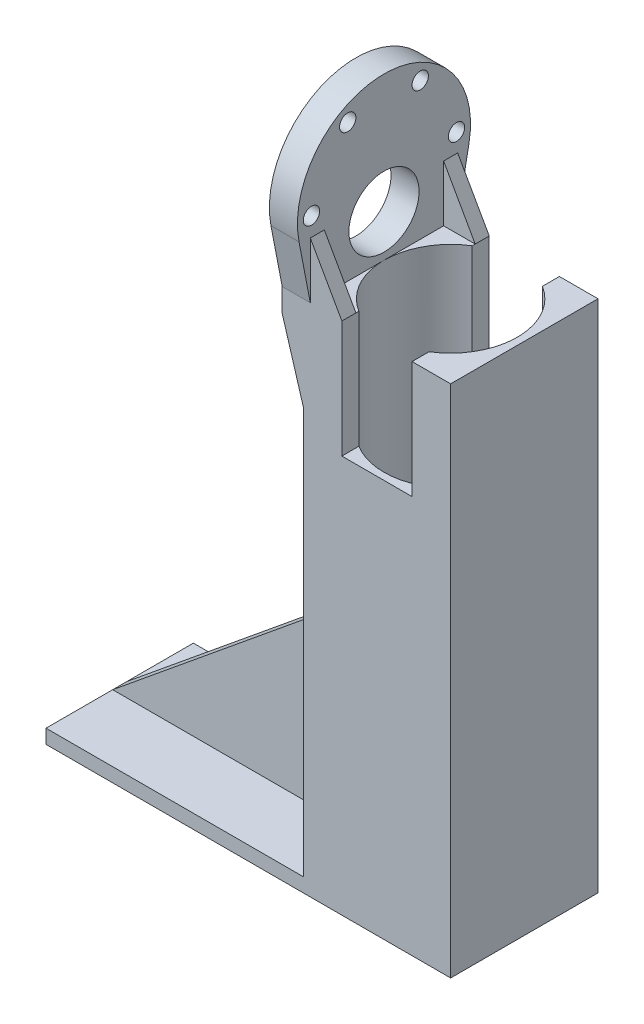
ISO-10303-21;
HEADER;
FILE_DESCRIPTION(('STEP AP214'),'2;1');
FILE_NAME('part.step','',(''),(''),'','','');
FILE_SCHEMA(('AUTOMOTIVE_DESIGN { 1 0 10303 214 1 1 1 1 }'));
ENDSEC;
DATA;
#1=APPLICATION_CONTEXT('core data for automotive mechanical design processes');
#2=APPLICATION_PROTOCOL_DEFINITION('international standard','automotive_design',2000,#1);
#3=PRODUCT_CONTEXT('',#1,'mechanical');
#4=PRODUCT('Part','Part','',(#3));
#5=PRODUCT_RELATED_PRODUCT_CATEGORY('part','',(#4));
#6=PRODUCT_DEFINITION_FORMATION('','',#4);
#7=PRODUCT_DEFINITION_CONTEXT('part definition',#1,'design');
#8=PRODUCT_DEFINITION('design','',#6,#7);
#9=PRODUCT_DEFINITION_SHAPE('','',#8);
#10=(LENGTH_UNIT() NAMED_UNIT(*) SI_UNIT(.MILLI.,.METRE.));
#11=(NAMED_UNIT(*) PLANE_ANGLE_UNIT() SI_UNIT($,.RADIAN.));
#12=(NAMED_UNIT(*) SI_UNIT($,.STERADIAN.) SOLID_ANGLE_UNIT());
#13=UNCERTAINTY_MEASURE_WITH_UNIT(LENGTH_MEASURE(1.E-05),#10,'distance_accuracy_value','');
#14=(GEOMETRIC_REPRESENTATION_CONTEXT(3) GLOBAL_UNCERTAINTY_ASSIGNED_CONTEXT((#13)) GLOBAL_UNIT_ASSIGNED_CONTEXT((#10,
#11,#12)) REPRESENTATION_CONTEXT('',''));
#15=CARTESIAN_POINT('',(0.,0.,0.));
#16=DIRECTION('',(0.,0.,1.));
#17=DIRECTION('',(1.,0.,0.));
#18=AXIS2_PLACEMENT_3D('',#15,#16,#17);
#19=CARTESIAN_POINT('',(0.,110.,0.));
#20=DIRECTION('',(0.,1.,0.));
#21=DIRECTION('',(0.,0.,1.));
#22=AXIS2_PLACEMENT_3D('',#19,#20,#21);
#23=PLANE('',#22);
#24=DIRECTION('',(0.,0.,1.));
#25=VECTOR('',#24,1.);
#26=CARTESIAN_POINT('',(8.25,110.,31.5));
#27=LINE('',#26,#25);
#28=CARTESIAN_POINT('',(8.25,110.,3.));
#29=VERTEX_POINT('',#28);
#30=CARTESIAN_POINT('',(8.25,110.,3.63337918394737));
#31=VERTEX_POINT('',#30);
#32=EDGE_CURVE('E362',#29,#31,#27,.T.);
#33=ORIENTED_EDGE('',*,*,#32,.F.);
#34=DIRECTION('',(-1.,0.,0.));
#35=VECTOR('',#34,1.);
#36=CARTESIAN_POINT('',(8.25,110.,3.));
#37=LINE('',#36,#35);
#38=CARTESIAN_POINT('',(1.5,110.,3.));
#39=VERTEX_POINT('',#38);
#40=EDGE_CURVE('E264',#29,#39,#37,.T.);
#41=ORIENTED_EDGE('',*,*,#40,.T.);
#42=DIRECTION('',(0.,0.,1.));
#43=VECTOR('',#42,1.);
#44=CARTESIAN_POINT('',(1.5,110.,0.));
#45=LINE('',#44,#43);
#46=CARTESIAN_POINT('',(1.5,110.,15.75));
#47=VERTEX_POINT('',#46);
#48=EDGE_CURVE('E441',#39,#47,#45,.T.);
#49=ORIENTED_EDGE('',*,*,#48,.T.);
#50=CARTESIAN_POINT('',(15.75,110.,15.75));
#51=DIRECTION('',(0.,1.,0.));
#52=DIRECTION('',(0.,0.,1.));
#53=AXIS2_PLACEMENT_3D('',#50,#51,#52);
#54=CIRCLE('',#53,14.25);
#55=EDGE_CURVE('E452',#31,#47,#54,.T.);
#56=ORIENTED_EDGE('',*,*,#55,.F.);
#57=EDGE_LOOP('',(#33,#41,#49,#56));
#58=FACE_BOUND('',#57,.T.);
#59=ADVANCED_FACE('F43',(#58),#23,.T.);
#60=CARTESIAN_POINT('',(1.5,126.,15.75));
#61=DIRECTION('',(-1.,0.,0.));
#62=DIRECTION('',(0.,0.,1.));
#63=AXIS2_PLACEMENT_3D('',#60,#61,#62);
#64=PLANE('',#63);
#65=CARTESIAN_POINT('',(1.5,126.,31.25));
#66=DIRECTION('',(-1.,0.,0.));
#67=DIRECTION('',(0.,0.,1.));
#68=AXIS2_PLACEMENT_3D('',#65,#66,#67);
#69=CIRCLE('',#68,1.75);
#70=CARTESIAN_POINT('',(1.50000000000001,126.,33.));
#71=VERTEX_POINT('',#70);
#72=EDGE_CURVE('E252',#71,#71,#69,.T.);
#73=ORIENTED_EDGE('',*,*,#72,.T.);
#74=EDGE_LOOP('',(#73));
#75=FACE_BOUND('',#74,.T.);
#76=CARTESIAN_POINT('',(1.5,126.,0.249999999999993));
#77=DIRECTION('',(-1.,0.,0.));
#78=DIRECTION('',(0.,0.,1.));
#79=AXIS2_PLACEMENT_3D('',#76,#77,#78);
#80=CIRCLE('',#79,1.75);
#81=CARTESIAN_POINT('',(1.5,126.,1.99999999999999));
#82=VERTEX_POINT('',#81);
#83=EDGE_CURVE('E522',#82,#82,#80,.T.);
#84=ORIENTED_EDGE('',*,*,#83,.T.);
#85=EDGE_LOOP('',(#84));
#86=FACE_BOUND('',#85,.T.);
#87=CARTESIAN_POINT('',(1.5,139.423393758659,7.99999999999995));
#88=DIRECTION('',(-1.,0.,0.));
#89=DIRECTION('',(0.,0.,1.));
#90=AXIS2_PLACEMENT_3D('',#87,#88,#89);
#91=CIRCLE('',#90,1.74999999999999);
#92=CARTESIAN_POINT('',(1.5,139.423393758659,9.74999999999994));
#93=VERTEX_POINT('',#92);
#94=EDGE_CURVE('E518',#93,#93,#91,.T.);
#95=ORIENTED_EDGE('',*,*,#94,.T.);
#96=EDGE_LOOP('',(#95));
#97=FACE_BOUND('',#96,.T.);
#98=CARTESIAN_POINT('',(1.5,139.423393758659,23.5));
#99=DIRECTION('',(-1.,0.,0.));
#100=DIRECTION('',(0.,0.,1.));
#101=AXIS2_PLACEMENT_3D('',#98,#99,#100);
#102=CIRCLE('',#101,1.75000000000001);
#103=CARTESIAN_POINT('',(1.5,139.423393758659,25.25));
#104=VERTEX_POINT('',#103);
#105=EDGE_CURVE('E514',#104,#104,#102,.T.);
#106=ORIENTED_EDGE('',*,*,#105,.T.);
#107=EDGE_LOOP('',(#106));
#108=FACE_BOUND('',#107,.T.);
#109=CARTESIAN_POINT('',(1.5,119.,15.75));
#110=DIRECTION('',(-1.,0.,0.));
#111=DIRECTION('',(0.,0.,1.));
#112=AXIS2_PLACEMENT_3D('',#109,#110,#111);
#113=CIRCLE('',#112,7.5);
#114=CARTESIAN_POINT('',(1.5,119.,23.25));
#115=VERTEX_POINT('',#114);
#116=EDGE_CURVE('E509',#115,#115,#113,.T.);
#117=ORIENTED_EDGE('',*,*,#116,.T.);
#118=EDGE_LOOP('',(#117));
#119=FACE_BOUND('',#118,.T.);
#120=DIRECTION('',(0.,1.,0.));
#121=VECTOR('',#120,1.);
#122=CARTESIAN_POINT('',(1.5,110.,3.));
#123=LINE('',#122,#121);
#124=CARTESIAN_POINT('',(1.5,122.,3.));
#125=VERTEX_POINT('',#124);
#126=EDGE_CURVE('E269',#39,#125,#123,.T.);
#127=ORIENTED_EDGE('',*,*,#126,.T.);
#128=DIRECTION('',(0.,0.,-1.));
#129=VECTOR('',#128,1.);
#130=CARTESIAN_POINT('',(1.5,122.,3.));
#131=LINE('',#130,#129);
#132=CARTESIAN_POINT('',(1.5,122.,0.));
#133=VERTEX_POINT('',#132);
#134=EDGE_CURVE('E273',#125,#133,#131,.T.);
#135=ORIENTED_EDGE('',*,*,#134,.T.);
#136=DIRECTION('',(0.,1.,0.));
#137=VECTOR('',#136,1.);
#138=CARTESIAN_POINT('',(1.5,110.,0.));
#139=LINE('',#138,#137);
#140=CARTESIAN_POINT('',(1.5,110.,0.));
#141=VERTEX_POINT('',#140);
#142=EDGE_CURVE('E265',#141,#133,#139,.T.);
#143=ORIENTED_EDGE('',*,*,#142,.F.);
#144=DIRECTION('',(0.,-0.981830363757147,0.189760735676559));
#145=VECTOR('',#144,1.);
#146=CARTESIAN_POINT('',(1.5,122.489426389984,-2.41386172950722));
#147=LINE('',#146,#145);
#148=CARTESIAN_POINT('',(1.5,122.489426389984,-2.41386172950722));
#149=VERTEX_POINT('',#148);
#150=EDGE_CURVE('E431',#149,#141,#147,.T.);
#151=ORIENTED_EDGE('',*,*,#150,.F.);
#152=CARTESIAN_POINT('',(1.5,126.,15.75));
#153=DIRECTION('',(-1.,0.,0.));
#154=DIRECTION('',(0.,0.,1.));
#155=AXIS2_PLACEMENT_3D('',#152,#153,#154);
#156=CIRCLE('',#155,18.5);
#157=CARTESIAN_POINT('',(1.5,122.489426389984,33.9138617295072));
#158=VERTEX_POINT('',#157);
#159=EDGE_CURVE('E228',#158,#149,#156,.T.);
#160=ORIENTED_EDGE('',*,*,#159,.F.);
#161=DIRECTION('',(0.,-0.981830363757147,-0.189760735676559));
#162=VECTOR('',#161,1.);
#163=CARTESIAN_POINT('',(1.5,122.489426389984,33.9138617295072));
#164=LINE('',#163,#162);
#165=CARTESIAN_POINT('',(1.5,110.,31.5));
#166=VERTEX_POINT('',#165);
#167=EDGE_CURVE('E425',#158,#166,#164,.T.);
#168=ORIENTED_EDGE('',*,*,#167,.T.);
#169=DIRECTION('',(0.,-1.,0.));
#170=VECTOR('',#169,1.);
#171=CARTESIAN_POINT('',(1.5,110.,31.5));
#172=LINE('',#171,#170);
#173=CARTESIAN_POINT('',(1.5,122.,31.5));
#174=VERTEX_POINT('',#173);
#175=EDGE_CURVE('E289',#174,#166,#172,.T.);
#176=ORIENTED_EDGE('',*,*,#175,.F.);
#177=DIRECTION('',(0.,0.,1.));
#178=VECTOR('',#177,1.);
#179=CARTESIAN_POINT('',(1.5,122.,28.5));
#180=LINE('',#179,#178);
#181=CARTESIAN_POINT('',(1.5,122.,28.5));
#182=VERTEX_POINT('',#181);
#183=EDGE_CURVE('E297',#182,#174,#180,.T.);
#184=ORIENTED_EDGE('',*,*,#183,.F.);
#185=DIRECTION('',(0.,-1.,0.));
#186=VECTOR('',#185,1.);
#187=CARTESIAN_POINT('',(1.5,110.,28.5));
#188=LINE('',#187,#186);
#189=CARTESIAN_POINT('',(1.5,110.,28.5));
#190=VERTEX_POINT('',#189);
#191=EDGE_CURVE('E288',#182,#190,#188,.T.);
#192=ORIENTED_EDGE('',*,*,#191,.T.);
#193=EDGE_CURVE('E233',#47,#190,#45,.T.);
#194=ORIENTED_EDGE('',*,*,#193,.F.);
#195=ORIENTED_EDGE('',*,*,#48,.F.);
#196=EDGE_LOOP('',(#127,#135,#143,#151,#160,#168,#176,#184,#192,#194,#195));
#197=FACE_BOUND('',#196,.T.);
#198=ADVANCED_FACE('F540',(#75,#86,#97,#108,#119,#197),#64,.F.);
#199=CARTESIAN_POINT('',(0.,110.,0.));
#200=DIRECTION('',(1.,0.,0.));
#201=DIRECTION('',(0.,0.,-1.));
#202=AXIS2_PLACEMENT_3D('',#199,#200,#201);
#203=PLANE('',#202);
#204=DIRECTION('',(0.,-1.,0.));
#205=VECTOR('',#204,1.);
#206=CARTESIAN_POINT('',(0.,47.9999999999995,14.25));
#207=LINE('',#206,#205);
#208=CARTESIAN_POINT('',(0.,47.9999999999995,14.25));
#209=VERTEX_POINT('',#208);
#210=CARTESIAN_POINT('',(0.,3.,14.25));
#211=VERTEX_POINT('',#210);
#212=EDGE_CURVE('E316',#209,#211,#207,.T.);
#213=ORIENTED_EDGE('',*,*,#212,.F.);
#214=DIRECTION('',(0.,0.,1.));
#215=VECTOR('',#214,1.);
#216=CARTESIAN_POINT('',(0.,47.9999999999995,14.25));
#217=LINE('',#216,#215);
#218=CARTESIAN_POINT('',(0.,47.9999999999995,17.25));
#219=VERTEX_POINT('',#218);
#220=EDGE_CURVE('E319',#209,#219,#217,.T.);
#221=ORIENTED_EDGE('',*,*,#220,.T.);
#222=DIRECTION('',(0.,-1.,0.));
#223=VECTOR('',#222,1.);
#224=CARTESIAN_POINT('',(0.,47.9999999999995,17.25));
#225=LINE('',#224,#223);
#226=CARTESIAN_POINT('',(0.,3.,17.25));
#227=VERTEX_POINT('',#226);
#228=EDGE_CURVE('E313',#219,#227,#225,.T.);
#229=ORIENTED_EDGE('',*,*,#228,.T.);
#230=DIRECTION('',(0.,0.,-1.));
#231=VECTOR('',#230,1.);
#232=CARTESIAN_POINT('',(0.,3.,31.5));
#233=LINE('',#232,#231);
#234=CARTESIAN_POINT('',(0.,3.,31.5));
#235=VERTEX_POINT('',#234);
#236=EDGE_CURVE('E383',#235,#227,#233,.T.);
#237=ORIENTED_EDGE('',*,*,#236,.F.);
#238=DIRECTION('',(0.,-1.,0.));
#239=VECTOR('',#238,1.);
#240=CARTESIAN_POINT('',(0.,110.,31.5));
#241=LINE('',#240,#239);
#242=CARTESIAN_POINT('',(0.,90.,31.5));
#243=VERTEX_POINT('',#242);
#244=EDGE_CURVE('E486',#243,#235,#241,.T.);
#245=ORIENTED_EDGE('',*,*,#244,.F.);
#246=DIRECTION('',(0.,0.,1.));
#247=VECTOR('',#246,1.);
#248=CARTESIAN_POINT('',(0.,90.,-20.5));
#249=LINE('',#248,#247);
#250=CARTESIAN_POINT('',(0.,90.,0.));
#251=VERTEX_POINT('',#250);
#252=EDGE_CURVE('E422',#251,#243,#249,.T.);
#253=ORIENTED_EDGE('',*,*,#252,.F.);
#254=DIRECTION('',(0.,-1.,0.));
#255=VECTOR('',#254,1.);
#256=CARTESIAN_POINT('',(0.,110.,0.));
#257=LINE('',#256,#255);
#258=CARTESIAN_POINT('',(0.,3.,0.));
#259=VERTEX_POINT('',#258);
#260=EDGE_CURVE('E465',#251,#259,#257,.T.);
#261=ORIENTED_EDGE('',*,*,#260,.T.);
#262=EDGE_CURVE('E366',#211,#259,#233,.T.);
#263=ORIENTED_EDGE('',*,*,#262,.F.);
#264=EDGE_LOOP('',(#213,#221,#229,#237,#245,#253,#261,#263));
#265=FACE_BOUND('',#264,.T.);
#266=ADVANCED_FACE('F45',(#265),#203,.F.);
#267=CARTESIAN_POINT('',(-55.,3.,31.5));
#268=DIRECTION('',(0.,-1.,0.));
#269=DIRECTION('',(0.,0.,-1.));
#270=AXIS2_PLACEMENT_3D('',#267,#268,#269);
#271=PLANE('',#270);
#272=DIRECTION('',(-1.,0.,0.));
#273=VECTOR('',#272,1.);
#274=CARTESIAN_POINT('',(0.,3.,14.25));
#275=LINE('',#274,#273);
#276=CARTESIAN_POINT('',(-55.,3.,14.25));
#277=VERTEX_POINT('',#276);
#278=EDGE_CURVE('E69',#211,#277,#275,.T.);
#279=ORIENTED_EDGE('',*,*,#278,.F.);
#280=ORIENTED_EDGE('',*,*,#262,.T.);
#281=DIRECTION('',(1.,0.,0.));
#282=VECTOR('',#281,1.);
#283=CARTESIAN_POINT('',(-55.,3.,0.));
#284=LINE('',#283,#282);
#285=CARTESIAN_POINT('',(-55.,3.,0.));
#286=VERTEX_POINT('',#285);
#287=EDGE_CURVE('E396',#286,#259,#284,.T.);
#288=ORIENTED_EDGE('',*,*,#287,.F.);
#289=DIRECTION('',(0.,0.,-1.));
#290=VECTOR('',#289,1.);
#291=CARTESIAN_POINT('',(-55.,3.,31.5));
#292=LINE('',#291,#290);
#293=EDGE_CURVE('E382',#277,#286,#292,.T.);
#294=ORIENTED_EDGE('',*,*,#293,.F.);
#295=EDGE_LOOP('',(#279,#280,#288,#294));
#296=FACE_BOUND('',#295,.T.);
#297=ADVANCED_FACE('F574',(#296),#271,.F.);
#298=DIRECTION('',(0.,0.,-1.));
#299=VECTOR('',#298,1.);
#300=CARTESIAN_POINT('',(23.25,110.,31.5));
#301=LINE('',#300,#299);
#302=CARTESIAN_POINT('',(23.25,110.,31.5));
#303=VERTEX_POINT('',#302);
#304=CARTESIAN_POINT('',(23.25,110.,27.8666208160526));
#305=VERTEX_POINT('',#304);
#306=EDGE_CURVE('E354',#303,#305,#301,.T.);
#307=ORIENTED_EDGE('',*,*,#306,.F.);
#308=DIRECTION('',(1.,0.,0.));
#309=VECTOR('',#308,1.);
#310=CARTESIAN_POINT('',(0.,110.,31.5));
#311=LINE('',#310,#309);
#312=CARTESIAN_POINT('',(31.5,110.,31.5));
#313=VERTEX_POINT('',#312);
#314=EDGE_CURVE('E458',#303,#313,#311,.T.);
#315=ORIENTED_EDGE('',*,*,#314,.T.);
#316=DIRECTION('',(0.,0.,1.));
#317=VECTOR('',#316,1.);
#318=CARTESIAN_POINT('',(31.5,110.,0.));
#319=LINE('',#318,#317);
#320=CARTESIAN_POINT('',(31.5,110.,0.));
#321=VERTEX_POINT('',#320);
#322=EDGE_CURVE('E457',#321,#313,#319,.T.);
#323=ORIENTED_EDGE('',*,*,#322,.F.);
#324=DIRECTION('',(1.,0.,0.));
#325=VECTOR('',#324,1.);
#326=CARTESIAN_POINT('',(0.,110.,0.));
#327=LINE('',#326,#325);
#328=CARTESIAN_POINT('',(23.25,110.,0.));
#329=VERTEX_POINT('',#328);
#330=EDGE_CURVE('E462',#329,#321,#327,.T.);
#331=ORIENTED_EDGE('',*,*,#330,.F.);
#332=CARTESIAN_POINT('',(23.25,110.,3.63337918394737));
#333=VERTEX_POINT('',#332);
#334=EDGE_CURVE('E336',#333,#329,#301,.T.);
#335=ORIENTED_EDGE('',*,*,#334,.F.);
#336=EDGE_CURVE('E451',#305,#333,#54,.T.);
#337=ORIENTED_EDGE('',*,*,#336,.F.);
#338=EDGE_LOOP('',(#307,#315,#323,#331,#335,#337));
#339=FACE_BOUND('',#338,.T.);
#340=ADVANCED_FACE('F563',(#339),#23,.T.);
#341=DIRECTION('',(1.,0.,0.));
#342=VECTOR('',#341,1.);
#343=CARTESIAN_POINT('',(8.25,110.,28.5));
#344=LINE('',#343,#342);
#345=CARTESIAN_POINT('',(8.25,110.,28.5));
#346=VERTEX_POINT('',#345);
#347=EDGE_CURVE('E293',#190,#346,#344,.T.);
#348=ORIENTED_EDGE('',*,*,#347,.T.);
#349=CARTESIAN_POINT('',(8.25,110.,27.8666208160526));
#350=VERTEX_POINT('',#349);
#351=EDGE_CURVE('E357',#350,#346,#27,.T.);
#352=ORIENTED_EDGE('',*,*,#351,.F.);
#353=EDGE_CURVE('E447',#47,#350,#54,.T.);
#354=ORIENTED_EDGE('',*,*,#353,.F.);
#355=ORIENTED_EDGE('',*,*,#193,.T.);
#356=EDGE_LOOP('',(#348,#352,#354,#355));
#357=FACE_BOUND('',#356,.T.);
#358=ADVANCED_FACE('F564',(#357),#23,.T.);
#359=CARTESIAN_POINT('',(0.,110.,31.5));
#360=DIRECTION('',(0.,0.,-1.));
#361=DIRECTION('',(-1.,0.,0.));
#362=AXIS2_PLACEMENT_3D('',#359,#360,#361);
#363=PLANE('',#362);
#364=ORIENTED_EDGE('',*,*,#314,.F.);
#365=DIRECTION('',(0.,1.,0.));
#366=VECTOR('',#365,1.);
#367=CARTESIAN_POINT('',(23.25,85.,31.5));
#368=LINE('',#367,#366);
#369=CARTESIAN_POINT('',(23.25,85.,31.5));
#370=VERTEX_POINT('',#369);
#371=EDGE_CURVE('E363',#370,#303,#368,.T.);
#372=ORIENTED_EDGE('',*,*,#371,.F.);
#373=DIRECTION('',(1.,0.,0.));
#374=VECTOR('',#373,1.);
#375=CARTESIAN_POINT('',(23.25,85.,31.5));
#376=LINE('',#375,#374);
#377=CARTESIAN_POINT('',(8.25,85.,31.5));
#378=VERTEX_POINT('',#377);
#379=EDGE_CURVE('E349',#378,#370,#376,.T.);
#380=ORIENTED_EDGE('',*,*,#379,.F.);
#381=DIRECTION('',(0.,1.,0.));
#382=VECTOR('',#381,1.);
#383=CARTESIAN_POINT('',(8.25,85.,31.5));
#384=LINE('',#383,#382);
#385=CARTESIAN_POINT('',(8.25,110.,31.5));
#386=VERTEX_POINT('',#385);
#387=EDGE_CURVE('E367',#378,#386,#384,.T.);
#388=ORIENTED_EDGE('',*,*,#387,.T.);
#389=DIRECTION('',(-0.490261239632559,0.871575537124549,0.));
#390=VECTOR('',#389,1.);
#391=CARTESIAN_POINT('',(1.5,122.,31.5));
#392=LINE('',#391,#390);
#393=EDGE_CURVE('E283',#386,#174,#392,.T.);
#394=ORIENTED_EDGE('',*,*,#393,.T.);
#395=ORIENTED_EDGE('',*,*,#175,.T.);
#396=CARTESIAN_POINT('',(-4.5,110.,31.5));
#397=VERTEX_POINT('',#396);
#398=EDGE_CURVE('E453',#397,#166,#311,.T.);
#399=ORIENTED_EDGE('',*,*,#398,.F.);
#400=DIRECTION('',(0.,-1.,0.));
#401=VECTOR('',#400,1.);
#402=CARTESIAN_POINT('',(-4.5,110.,31.5));
#403=LINE('',#402,#401);
#404=CARTESIAN_POINT('',(-4.5,105.,31.5));
#405=VERTEX_POINT('',#404);
#406=EDGE_CURVE('E407',#397,#405,#403,.T.);
#407=ORIENTED_EDGE('',*,*,#406,.T.);
#408=DIRECTION('',(0.287347885566345,-0.957826285221152,0.));
#409=VECTOR('',#408,1.);
#410=CARTESIAN_POINT('',(-4.5,105.,31.5));
#411=LINE('',#410,#409);
#412=EDGE_CURVE('E408',#405,#243,#411,.T.);
#413=ORIENTED_EDGE('',*,*,#412,.T.);
#414=ORIENTED_EDGE('',*,*,#244,.T.);
#415=DIRECTION('',(1.,0.,0.));
#416=VECTOR('',#415,1.);
#417=CARTESIAN_POINT('',(-55.,3.,31.5));
#418=LINE('',#417,#416);
#419=CARTESIAN_POINT('',(-55.,3.,31.5));
#420=VERTEX_POINT('',#419);
#421=EDGE_CURVE('E403',#420,#235,#418,.T.);
#422=ORIENTED_EDGE('',*,*,#421,.F.);
#423=DIRECTION('',(0.,1.,0.));
#424=VECTOR('',#423,1.);
#425=CARTESIAN_POINT('',(-55.,0.,31.5));
#426=LINE('',#425,#424);
#427=CARTESIAN_POINT('',(-55.,0.,31.5));
#428=VERTEX_POINT('',#427);
#429=EDGE_CURVE('E378',#428,#420,#426,.T.);
#430=ORIENTED_EDGE('',*,*,#429,.F.);
#431=DIRECTION('',(1.,0.,0.));
#432=VECTOR('',#431,1.);
#433=CARTESIAN_POINT('',(0.,0.,31.5));
#434=LINE('',#433,#432);
#435=CARTESIAN_POINT('',(31.5,0.,31.5));
#436=VERTEX_POINT('',#435);
#437=EDGE_CURVE('E446',#428,#436,#434,.T.);
#438=ORIENTED_EDGE('',*,*,#437,.T.);
#439=DIRECTION('',(0.,-1.,0.));
#440=VECTOR('',#439,1.);
#441=CARTESIAN_POINT('',(31.5,110.,31.5));
#442=LINE('',#441,#440);
#443=EDGE_CURVE('E483',#313,#436,#442,.T.);
#444=ORIENTED_EDGE('',*,*,#443,.F.);
#445=EDGE_LOOP('',(#364,#372,#380,#388,#394,#395,#399,#407,#413,#414,#422,#430,#438,#444));
#446=FACE_BOUND('',#445,.T.);
#447=ADVANCED_FACE('F577',(#446),#363,.F.);
#448=CARTESIAN_POINT('',(31.5,110.,0.));
#449=DIRECTION('',(1.,0.,0.));
#450=DIRECTION('',(0.,0.,-1.));
#451=AXIS2_PLACEMENT_3D('',#448,#449,#450);
#452=PLANE('',#451);
#453=DIRECTION('',(0.,0.,1.));
#454=VECTOR('',#453,1.);
#455=CARTESIAN_POINT('',(31.5,0.,0.));
#456=LINE('',#455,#454);
#457=CARTESIAN_POINT('',(31.5,0.,0.));
#458=VERTEX_POINT('',#457);
#459=EDGE_CURVE('E469',#458,#436,#456,.T.);
#460=ORIENTED_EDGE('',*,*,#459,.F.);
#461=DIRECTION('',(0.,-1.,0.));
#462=VECTOR('',#461,1.);
#463=CARTESIAN_POINT('',(31.5,110.,0.));
#464=LINE('',#463,#462);
#465=EDGE_CURVE('E480',#321,#458,#464,.T.);
#466=ORIENTED_EDGE('',*,*,#465,.F.);
#467=ORIENTED_EDGE('',*,*,#322,.T.);
#468=ORIENTED_EDGE('',*,*,#443,.T.);
#469=EDGE_LOOP('',(#460,#466,#467,#468));
#470=FACE_BOUND('',#469,.T.);
#471=ADVANCED_FACE('F582',(#470),#452,.T.);
#472=CARTESIAN_POINT('',(0.,110.,0.));
#473=DIRECTION('',(0.,0.,-1.));
#474=DIRECTION('',(-1.,0.,0.));
#475=AXIS2_PLACEMENT_3D('',#472,#473,#474);
#476=PLANE('',#475);
#477=DIRECTION('',(0.,1.,0.));
#478=VECTOR('',#477,1.);
#479=CARTESIAN_POINT('',(23.25,85.,0.));
#480=LINE('',#479,#478);
#481=CARTESIAN_POINT('',(23.25,85.,0.));
#482=VERTEX_POINT('',#481);
#483=EDGE_CURVE('E353',#482,#329,#480,.T.);
#484=ORIENTED_EDGE('',*,*,#483,.T.);
#485=ORIENTED_EDGE('',*,*,#330,.T.);
#486=ORIENTED_EDGE('',*,*,#465,.T.);
#487=DIRECTION('',(1.,0.,0.));
#488=VECTOR('',#487,1.);
#489=CARTESIAN_POINT('',(0.,0.,0.));
#490=LINE('',#489,#488);
#491=CARTESIAN_POINT('',(-55.,0.,0.));
#492=VERTEX_POINT('',#491);
#493=EDGE_CURVE('E473',#492,#458,#490,.T.);
#494=ORIENTED_EDGE('',*,*,#493,.F.);
#495=DIRECTION('',(0.,-1.,0.));
#496=VECTOR('',#495,1.);
#497=CARTESIAN_POINT('',(-55.,0.,0.));
#498=LINE('',#497,#496);
#499=EDGE_CURVE('E388',#286,#492,#498,.T.);
#500=ORIENTED_EDGE('',*,*,#499,.F.);
#501=ORIENTED_EDGE('',*,*,#287,.T.);
#502=ORIENTED_EDGE('',*,*,#260,.F.);
#503=DIRECTION('',(0.287347885566345,-0.957826285221151,0.));
#504=VECTOR('',#503,1.);
#505=CARTESIAN_POINT('',(-4.5,105.,0.));
#506=LINE('',#505,#504);
#507=CARTESIAN_POINT('',(-4.5,105.,0.));
#508=VERTEX_POINT('',#507);
#509=EDGE_CURVE('E419',#508,#251,#506,.T.);
#510=ORIENTED_EDGE('',*,*,#509,.F.);
#511=DIRECTION('',(0.,-1.,0.));
#512=VECTOR('',#511,1.);
#513=CARTESIAN_POINT('',(-4.5,110.,0.));
#514=LINE('',#513,#512);
#515=CARTESIAN_POINT('',(-4.5,110.,0.));
#516=VERTEX_POINT('',#515);
#517=EDGE_CURVE('E412',#516,#508,#514,.T.);
#518=ORIENTED_EDGE('',*,*,#517,.F.);
#519=EDGE_CURVE('E240',#516,#141,#327,.T.);
#520=ORIENTED_EDGE('',*,*,#519,.T.);
#521=ORIENTED_EDGE('',*,*,#142,.T.);
#522=DIRECTION('',(0.490261239632559,-0.871575537124549,0.));
#523=VECTOR('',#522,1.);
#524=CARTESIAN_POINT('',(1.5,122.,0.));
#525=LINE('',#524,#523);
#526=CARTESIAN_POINT('',(8.25,110.,0.));
#527=VERTEX_POINT('',#526);
#528=EDGE_CURVE('E261',#133,#527,#525,.T.);
#529=ORIENTED_EDGE('',*,*,#528,.T.);
#530=DIRECTION('',(0.,1.,0.));
#531=VECTOR('',#530,1.);
#532=CARTESIAN_POINT('',(8.25,85.,0.));
#533=LINE('',#532,#531);
#534=CARTESIAN_POINT('',(8.25,85.,0.));
#535=VERTEX_POINT('',#534);
#536=EDGE_CURVE('E371',#535,#527,#533,.T.);
#537=ORIENTED_EDGE('',*,*,#536,.F.);
#538=DIRECTION('',(-1.,0.,0.));
#539=VECTOR('',#538,1.);
#540=CARTESIAN_POINT('',(23.25,85.,0.));
#541=LINE('',#540,#539);
#542=EDGE_CURVE('E340',#482,#535,#541,.T.);
#543=ORIENTED_EDGE('',*,*,#542,.F.);
#544=EDGE_LOOP('',(#484,#485,#486,#494,#500,#501,#502,#510,#518,#520,#521,#529,#537,#543));
#545=FACE_BOUND('',#544,.T.);
#546=ADVANCED_FACE('F625',(#545),#476,.T.);
#547=CARTESIAN_POINT('',(0.,0.,0.));
#548=DIRECTION('',(0.,1.,0.));
#549=DIRECTION('',(0.,0.,1.));
#550=AXIS2_PLACEMENT_3D('',#547,#548,#549);
#551=PLANE('',#550);
#552=ORIENTED_EDGE('',*,*,#437,.F.);
#553=DIRECTION('',(0.,0.,1.));
#554=VECTOR('',#553,1.);
#555=CARTESIAN_POINT('',(-55.,0.,31.5));
#556=LINE('',#555,#554);
#557=EDGE_CURVE('E392',#492,#428,#556,.T.);
#558=ORIENTED_EDGE('',*,*,#557,.F.);
#559=ORIENTED_EDGE('',*,*,#493,.T.);
#560=ORIENTED_EDGE('',*,*,#459,.T.);
#561=EDGE_LOOP('',(#552,#558,#559,#560));
#562=FACE_BOUND('',#561,.T.);
#563=ADVANCED_FACE('F657',(#562),#551,.F.);
#564=CARTESIAN_POINT('',(15.75,2.,15.75));
#565=DIRECTION('',(0.,1.,0.));
#566=DIRECTION('',(0.,0.,1.));
#567=AXIS2_PLACEMENT_3D('',#564,#565,#566);
#568=CYLINDRICAL_SURFACE('',#567,14.25);
#569=ORIENTED_EDGE('',*,*,#336,.T.);
#570=DIRECTION('',(0.,1.,0.));
#571=VECTOR('',#570,1.);
#572=CARTESIAN_POINT('',(23.25,2.,3.63337918394737));
#573=LINE('',#572,#571);
#574=CARTESIAN_POINT('',(23.25,85.,3.63337918394737));
#575=VERTEX_POINT('',#574);
#576=EDGE_CURVE('E11',#333,#575,#573,.F.);
#577=ORIENTED_EDGE('',*,*,#576,.T.);
#578=CARTESIAN_POINT('',(15.75,85.,15.75));
#579=DIRECTION('',(0.,1.,0.));
#580=DIRECTION('',(0.,0.,1.));
#581=AXIS2_PLACEMENT_3D('',#578,#579,#580);
#582=CIRCLE('',#581,14.25);
#583=CARTESIAN_POINT('',(8.25,85.,3.63337918394737));
#584=VERTEX_POINT('',#583);
#585=EDGE_CURVE('E494',#584,#575,#582,.F.);
#586=ORIENTED_EDGE('',*,*,#585,.F.);
#587=DIRECTION('',(0.,1.,0.));
#588=VECTOR('',#587,1.);
#589=CARTESIAN_POINT('',(8.25,2.,3.63337918394737));
#590=LINE('',#589,#588);
#591=EDGE_CURVE('E53',#584,#31,#590,.T.);
#592=ORIENTED_EDGE('',*,*,#591,.T.);
#593=ORIENTED_EDGE('',*,*,#55,.T.);
#594=ORIENTED_EDGE('',*,*,#353,.T.);
#595=DIRECTION('',(0.,1.,0.));
#596=VECTOR('',#595,1.);
#597=CARTESIAN_POINT('',(8.25,2.,27.8666208160526));
#598=LINE('',#597,#596);
#599=CARTESIAN_POINT('',(8.25,85.,27.8666208160526));
#600=VERTEX_POINT('',#599);
#601=EDGE_CURVE('E493',#350,#600,#598,.F.);
#602=ORIENTED_EDGE('',*,*,#601,.T.);
#603=CARTESIAN_POINT('',(23.25,85.,27.8666208160526));
#604=VERTEX_POINT('',#603);
#605=EDGE_CURVE('E490',#604,#600,#582,.F.);
#606=ORIENTED_EDGE('',*,*,#605,.F.);
#607=DIRECTION('',(0.,1.,0.));
#608=VECTOR('',#607,1.);
#609=CARTESIAN_POINT('',(23.25,2.,27.8666208160526));
#610=LINE('',#609,#608);
#611=EDGE_CURVE('E498',#604,#305,#610,.T.);
#612=ORIENTED_EDGE('',*,*,#611,.T.);
#613=EDGE_LOOP('',(#569,#577,#586,#592,#593,#594,#602,#606,#612));
#614=FACE_BOUND('',#613,.T.);
#615=CARTESIAN_POINT('',(15.75,2.,15.75));
#616=DIRECTION('',(0.,1.,0.));
#617=DIRECTION('',(0.,0.,1.));
#618=AXIS2_PLACEMENT_3D('',#615,#616,#617);
#619=CIRCLE('',#618,14.25);
#620=CARTESIAN_POINT('',(15.75,2.,30.));
#621=VERTEX_POINT('',#620);
#622=EDGE_CURVE('E442',#621,#621,#619,.T.);
#623=ORIENTED_EDGE('',*,*,#622,.F.);
#624=EDGE_LOOP('',(#623));
#625=FACE_BOUND('',#624,.T.);
#626=ADVANCED_FACE('F604',(#614,#625),#568,.F.);
#627=CARTESIAN_POINT('',(15.75,2.,15.75));
#628=DIRECTION('',(0.,1.,0.));
#629=DIRECTION('',(0.,0.,1.));
#630=AXIS2_PLACEMENT_3D('',#627,#628,#629);
#631=PLANE('',#630);
#632=ORIENTED_EDGE('',*,*,#622,.T.);
#633=EDGE_LOOP('',(#632));
#634=FACE_BOUND('',#633,.T.);
#635=ADVANCED_FACE('F710',(#634),#631,.T.);
#636=CARTESIAN_POINT('',(1.5,122.489426389984,33.9138617295072));
#637=DIRECTION('',(0.,0.189760735676559,-0.981830363757147));
#638=DIRECTION('',(0.,0.981830363757147,0.189760735676559));
#639=AXIS2_PLACEMENT_3D('',#636,#637,#638);
#640=PLANE('',#639);
#641=DIRECTION('',(-1.,0.,0.));
#642=VECTOR('',#641,1.);
#643=CARTESIAN_POINT('',(1.5,122.489426389984,33.9138617295072));
#644=LINE('',#643,#642);
#645=CARTESIAN_POINT('',(-4.5,122.489426389984,33.9138617295072));
#646=VERTEX_POINT('',#645);
#647=EDGE_CURVE('E234',#158,#646,#644,.T.);
#648=ORIENTED_EDGE('',*,*,#647,.T.);
#649=DIRECTION('',(0.,0.981830363757147,0.189760735676559));
#650=VECTOR('',#649,1.);
#651=CARTESIAN_POINT('',(-4.5,122.489426389984,33.9138617295072));
#652=LINE('',#651,#650);
#653=EDGE_CURVE('E245',#397,#646,#652,.T.);
#654=ORIENTED_EDGE('',*,*,#653,.F.);
#655=ORIENTED_EDGE('',*,*,#398,.T.);
#656=ORIENTED_EDGE('',*,*,#167,.F.);
#657=EDGE_LOOP('',(#648,#654,#655,#656));
#658=FACE_BOUND('',#657,.T.);
#659=ADVANCED_FACE('F635',(#658),#640,.F.);
#660=CARTESIAN_POINT('',(1.5,122.489426389984,-2.41386172950722));
#661=DIRECTION('',(0.,-0.189760735676559,-0.981830363757147));
#662=DIRECTION('',(0.,0.981830363757147,-0.189760735676559));
#663=AXIS2_PLACEMENT_3D('',#660,#661,#662);
#664=PLANE('',#663);
#665=ORIENTED_EDGE('',*,*,#519,.F.);
#666=DIRECTION('',(0.,-0.981830363757147,0.189760735676559));
#667=VECTOR('',#666,1.);
#668=CARTESIAN_POINT('',(-4.5,122.489426389984,-2.41386172950722));
#669=LINE('',#668,#667);
#670=CARTESIAN_POINT('',(-4.5,122.489426389984,-2.41386172950722));
#671=VERTEX_POINT('',#670);
#672=EDGE_CURVE('E237',#671,#516,#669,.T.);
#673=ORIENTED_EDGE('',*,*,#672,.F.);
#674=DIRECTION('',(-1.,0.,0.));
#675=VECTOR('',#674,1.);
#676=CARTESIAN_POINT('',(1.5,122.489426389984,-2.41386172950722));
#677=LINE('',#676,#675);
#678=EDGE_CURVE('E222',#149,#671,#677,.T.);
#679=ORIENTED_EDGE('',*,*,#678,.F.);
#680=ORIENTED_EDGE('',*,*,#150,.T.);
#681=EDGE_LOOP('',(#665,#673,#679,#680));
#682=FACE_BOUND('',#681,.T.);
#683=ADVANCED_FACE('F238',(#682),#664,.T.);
#684=CARTESIAN_POINT('',(1.5,126.,15.75));
#685=DIRECTION('',(-1.,0.,0.));
#686=DIRECTION('',(0.,0.,1.));
#687=AXIS2_PLACEMENT_3D('',#684,#685,#686);
#688=CYLINDRICAL_SURFACE('',#687,18.5);
#689=ORIENTED_EDGE('',*,*,#678,.T.);
#690=CARTESIAN_POINT('',(-4.5,126.,15.75));
#691=DIRECTION('',(-1.,0.,0.));
#692=DIRECTION('',(0.,0.,1.));
#693=AXIS2_PLACEMENT_3D('',#690,#691,#692);
#694=CIRCLE('',#693,18.5);
#695=EDGE_CURVE('E226',#646,#671,#694,.T.);
#696=ORIENTED_EDGE('',*,*,#695,.F.);
#697=ORIENTED_EDGE('',*,*,#647,.F.);
#698=ORIENTED_EDGE('',*,*,#159,.T.);
#699=EDGE_LOOP('',(#689,#696,#697,#698));
#700=FACE_BOUND('',#699,.T.);
#701=ADVANCED_FACE('F224',(#700),#688,.T.);
#702=CARTESIAN_POINT('',(-4.5,110.,-20.5));
#703=DIRECTION('',(-1.,0.,0.));
#704=DIRECTION('',(0.,-1.,0.));
#705=AXIS2_PLACEMENT_3D('',#702,#703,#704);
#706=PLANE('',#705);
#707=CARTESIAN_POINT('',(-4.5,126.,31.25));
#708=DIRECTION('',(-1.,0.,0.));
#709=DIRECTION('',(0.,-1.,0.));
#710=AXIS2_PLACEMENT_3D('',#707,#708,#709);
#711=CIRCLE('',#710,1.75);
#712=CARTESIAN_POINT('',(-4.5,124.25,31.25));
#713=VERTEX_POINT('',#712);
#714=EDGE_CURVE('E47',#713,#713,#711,.T.);
#715=ORIENTED_EDGE('',*,*,#714,.F.);
#716=EDGE_LOOP('',(#715));
#717=FACE_BOUND('',#716,.T.);
#718=CARTESIAN_POINT('',(-4.5,126.,0.249999999999994));
#719=DIRECTION('',(-1.,0.,0.));
#720=DIRECTION('',(0.,-1.,0.));
#721=AXIS2_PLACEMENT_3D('',#718,#719,#720);
#722=CIRCLE('',#721,1.75);
#723=CARTESIAN_POINT('',(-4.5,124.25,0.249999999999994));
#724=VERTEX_POINT('',#723);
#725=EDGE_CURVE('E519',#724,#724,#722,.T.);
#726=ORIENTED_EDGE('',*,*,#725,.F.);
#727=EDGE_LOOP('',(#726));
#728=FACE_BOUND('',#727,.T.);
#729=CARTESIAN_POINT('',(-4.5,139.423393758659,7.99999999999995));
#730=DIRECTION('',(-1.,0.,0.));
#731=DIRECTION('',(0.,-1.,0.));
#732=AXIS2_PLACEMENT_3D('',#729,#730,#731);
#733=CIRCLE('',#732,1.74999999999999);
#734=CARTESIAN_POINT('',(-4.5,137.673393758659,7.99999999999995));
#735=VERTEX_POINT('',#734);
#736=EDGE_CURVE('E515',#735,#735,#733,.T.);
#737=ORIENTED_EDGE('',*,*,#736,.F.);
#738=EDGE_LOOP('',(#737));
#739=FACE_BOUND('',#738,.T.);
#740=CARTESIAN_POINT('',(-4.5,139.423393758659,23.5));
#741=DIRECTION('',(-1.,0.,0.));
#742=DIRECTION('',(0.,-1.,0.));
#743=AXIS2_PLACEMENT_3D('',#740,#741,#742);
#744=CIRCLE('',#743,1.75000000000001);
#745=CARTESIAN_POINT('',(-4.5,137.673393758659,23.5));
#746=VERTEX_POINT('',#745);
#747=EDGE_CURVE('E510',#746,#746,#744,.T.);
#748=ORIENTED_EDGE('',*,*,#747,.F.);
#749=EDGE_LOOP('',(#748));
#750=FACE_BOUND('',#749,.T.);
#751=CARTESIAN_POINT('',(-4.5,119.,15.75));
#752=DIRECTION('',(-1.,0.,0.));
#753=DIRECTION('',(0.,-1.,0.));
#754=AXIS2_PLACEMENT_3D('',#751,#752,#753);
#755=CIRCLE('',#754,7.5);
#756=CARTESIAN_POINT('',(-4.5,111.5,15.75));
#757=VERTEX_POINT('',#756);
#758=EDGE_CURVE('E505',#757,#757,#755,.T.);
#759=ORIENTED_EDGE('',*,*,#758,.F.);
#760=EDGE_LOOP('',(#759));
#761=FACE_BOUND('',#760,.T.);
#762=ORIENTED_EDGE('',*,*,#672,.T.);
#763=ORIENTED_EDGE('',*,*,#517,.T.);
#764=DIRECTION('',(0.,0.,1.));
#765=VECTOR('',#764,1.);
#766=CARTESIAN_POINT('',(-4.5,105.,-20.5));
#767=LINE('',#766,#765);
#768=EDGE_CURVE('E418',#508,#405,#767,.T.);
#769=ORIENTED_EDGE('',*,*,#768,.T.);
#770=ORIENTED_EDGE('',*,*,#406,.F.);
#771=ORIENTED_EDGE('',*,*,#653,.T.);
#772=ORIENTED_EDGE('',*,*,#695,.T.);
#773=EDGE_LOOP('',(#762,#763,#769,#770,#771,#772));
#774=FACE_BOUND('',#773,.T.);
#775=ADVANCED_FACE('F248',(#717,#728,#739,#750,#761,#774),#706,.T.);
#776=CARTESIAN_POINT('',(-4.5,105.,-20.5));
#777=DIRECTION('',(-0.957826285221151,-0.287347885566345,0.));
#778=DIRECTION('',(0.287347885566345,-0.957826285221151,0.));
#779=AXIS2_PLACEMENT_3D('',#776,#777,#778);
#780=PLANE('',#779);
#781=ORIENTED_EDGE('',*,*,#768,.F.);
#782=ORIENTED_EDGE('',*,*,#509,.T.);
#783=ORIENTED_EDGE('',*,*,#252,.T.);
#784=ORIENTED_EDGE('',*,*,#412,.F.);
#785=EDGE_LOOP('',(#781,#782,#783,#784));
#786=FACE_BOUND('',#785,.T.);
#787=ADVANCED_FACE('F639',(#786),#780,.T.);
#788=ORIENTED_EDGE('',*,*,#236,.T.);
#789=DIRECTION('',(-1.,0.,0.));
#790=VECTOR('',#789,1.);
#791=CARTESIAN_POINT('',(0.,3.,17.25));
#792=LINE('',#791,#790);
#793=CARTESIAN_POINT('',(-55.,3.,17.25));
#794=VERTEX_POINT('',#793);
#795=EDGE_CURVE('E307',#227,#794,#792,.T.);
#796=ORIENTED_EDGE('',*,*,#795,.T.);
#797=EDGE_CURVE('E384',#420,#794,#292,.T.);
#798=ORIENTED_EDGE('',*,*,#797,.F.);
#799=ORIENTED_EDGE('',*,*,#421,.T.);
#800=EDGE_LOOP('',(#788,#796,#798,#799));
#801=FACE_BOUND('',#800,.T.);
#802=ADVANCED_FACE('F648',(#801),#271,.F.);
#803=CARTESIAN_POINT('',(-55.,0.,0.));
#804=DIRECTION('',(-1.,0.,0.));
#805=DIRECTION('',(0.,0.,1.));
#806=AXIS2_PLACEMENT_3D('',#803,#804,#805);
#807=PLANE('',#806);
#808=ORIENTED_EDGE('',*,*,#429,.T.);
#809=ORIENTED_EDGE('',*,*,#797,.T.);
#810=DIRECTION('',(0.,0.,1.));
#811=VECTOR('',#810,1.);
#812=CARTESIAN_POINT('',(-55.,3.,14.25));
#813=LINE('',#812,#811);
#814=EDGE_CURVE('E332',#277,#794,#813,.T.);
#815=ORIENTED_EDGE('',*,*,#814,.F.);
#816=ORIENTED_EDGE('',*,*,#293,.T.);
#817=ORIENTED_EDGE('',*,*,#499,.T.);
#818=ORIENTED_EDGE('',*,*,#557,.T.);
#819=EDGE_LOOP('',(#808,#809,#815,#816,#817,#818));
#820=FACE_BOUND('',#819,.T.);
#821=ADVANCED_FACE('F652',(#820),#807,.T.);
#822=CARTESIAN_POINT('',(0.,85.,0.));
#823=DIRECTION('',(0.,1.,0.));
#824=DIRECTION('',(0.,0.,1.));
#825=AXIS2_PLACEMENT_3D('',#822,#823,#824);
#826=PLANE('',#825);
#827=ORIENTED_EDGE('',*,*,#605,.T.);
#828=DIRECTION('',(0.,0.,1.));
#829=VECTOR('',#828,1.);
#830=CARTESIAN_POINT('',(8.25,85.,31.5));
#831=LINE('',#830,#829);
#832=EDGE_CURVE('E345',#600,#378,#831,.T.);
#833=ORIENTED_EDGE('',*,*,#832,.T.);
#834=ORIENTED_EDGE('',*,*,#379,.T.);
#835=DIRECTION('',(0.,0.,-1.));
#836=VECTOR('',#835,1.);
#837=CARTESIAN_POINT('',(23.25,85.,31.5));
#838=LINE('',#837,#836);
#839=EDGE_CURVE('E337',#370,#604,#838,.T.);
#840=ORIENTED_EDGE('',*,*,#839,.T.);
#841=EDGE_LOOP('',(#827,#833,#834,#840));
#842=FACE_BOUND('',#841,.T.);
#843=ADVANCED_FACE('F674',(#842),#826,.T.);
#844=CARTESIAN_POINT('',(8.25,85.,31.5));
#845=DIRECTION('',(-1.,0.,0.));
#846=DIRECTION('',(0.,0.,1.));
#847=AXIS2_PLACEMENT_3D('',#844,#845,#846);
#848=PLANE('',#847);
#849=ORIENTED_EDGE('',*,*,#351,.T.);
#850=DIRECTION('',(0.,0.,1.));
#851=VECTOR('',#850,1.);
#852=CARTESIAN_POINT('',(8.25,110.,28.5));
#853=LINE('',#852,#851);
#854=EDGE_CURVE('E303',#346,#386,#853,.T.);
#855=ORIENTED_EDGE('',*,*,#854,.T.);
#856=ORIENTED_EDGE('',*,*,#387,.F.);
#857=ORIENTED_EDGE('',*,*,#832,.F.);
#858=ORIENTED_EDGE('',*,*,#601,.F.);
#859=EDGE_LOOP('',(#849,#855,#856,#857,#858));
#860=FACE_BOUND('',#859,.T.);
#861=ADVANCED_FACE('F591',(#860),#848,.F.);
#862=CARTESIAN_POINT('',(23.25,85.,31.5));
#863=DIRECTION('',(1.,0.,0.));
#864=DIRECTION('',(0.,0.,-1.));
#865=AXIS2_PLACEMENT_3D('',#862,#863,#864);
#866=PLANE('',#865);
#867=ORIENTED_EDGE('',*,*,#839,.F.);
#868=ORIENTED_EDGE('',*,*,#371,.T.);
#869=ORIENTED_EDGE('',*,*,#306,.T.);
#870=ORIENTED_EDGE('',*,*,#611,.F.);
#871=EDGE_LOOP('',(#867,#868,#869,#870));
#872=FACE_BOUND('',#871,.T.);
#873=ADVANCED_FACE('F672',(#872),#866,.F.);
#874=ORIENTED_EDGE('',*,*,#334,.T.);
#875=ORIENTED_EDGE('',*,*,#483,.F.);
#876=EDGE_CURVE('E341',#575,#482,#838,.T.);
#877=ORIENTED_EDGE('',*,*,#876,.F.);
#878=ORIENTED_EDGE('',*,*,#576,.F.);
#879=EDGE_LOOP('',(#874,#875,#877,#878));
#880=FACE_BOUND('',#879,.T.);
#881=ADVANCED_FACE('F621',(#880),#866,.F.);
#882=EDGE_CURVE('E346',#535,#584,#831,.T.);
#883=ORIENTED_EDGE('',*,*,#882,.F.);
#884=ORIENTED_EDGE('',*,*,#536,.T.);
#885=EDGE_CURVE('E358',#527,#29,#27,.T.);
#886=ORIENTED_EDGE('',*,*,#885,.T.);
#887=ORIENTED_EDGE('',*,*,#32,.T.);
#888=ORIENTED_EDGE('',*,*,#591,.F.);
#889=EDGE_LOOP('',(#883,#884,#886,#887,#888));
#890=FACE_BOUND('',#889,.T.);
#891=ADVANCED_FACE('F598',(#890),#848,.F.);
#892=ORIENTED_EDGE('',*,*,#585,.T.);
#893=ORIENTED_EDGE('',*,*,#876,.T.);
#894=ORIENTED_EDGE('',*,*,#542,.T.);
#895=ORIENTED_EDGE('',*,*,#882,.T.);
#896=EDGE_LOOP('',(#892,#893,#894,#895));
#897=FACE_BOUND('',#896,.T.);
#898=ADVANCED_FACE('F617',(#897),#826,.T.);
#899=CARTESIAN_POINT('',(-55.,3.,14.25));
#900=DIRECTION('',(0.633237790257259,-0.773957299203324,0.));
#901=DIRECTION('',(0.773957299203324,0.633237790257259,0.));
#902=AXIS2_PLACEMENT_3D('',#899,#900,#901);
#903=PLANE('',#902);
#904=DIRECTION('',(0.773957299203324,0.633237790257259,0.));
#905=VECTOR('',#904,1.);
#906=CARTESIAN_POINT('',(-55.,3.,17.25));
#907=LINE('',#906,#905);
#908=EDGE_CURVE('E323',#794,#219,#907,.T.);
#909=ORIENTED_EDGE('',*,*,#908,.T.);
#910=ORIENTED_EDGE('',*,*,#220,.F.);
#911=DIRECTION('',(0.773957299203324,0.633237790257259,0.));
#912=VECTOR('',#911,1.);
#913=CARTESIAN_POINT('',(-55.,3.,14.25));
#914=LINE('',#913,#912);
#915=EDGE_CURVE('E312',#277,#209,#914,.T.);
#916=ORIENTED_EDGE('',*,*,#915,.F.);
#917=ORIENTED_EDGE('',*,*,#814,.T.);
#918=EDGE_LOOP('',(#909,#910,#916,#917));
#919=FACE_BOUND('',#918,.T.);
#920=ADVANCED_FACE('F685',(#919),#903,.F.);
#921=CARTESIAN_POINT('',(0.,0.,14.25));
#922=DIRECTION('',(0.,0.,1.));
#923=DIRECTION('',(1.,0.,0.));
#924=AXIS2_PLACEMENT_3D('',#921,#922,#923);
#925=PLANE('',#924);
#926=ORIENTED_EDGE('',*,*,#278,.T.);
#927=ORIENTED_EDGE('',*,*,#915,.T.);
#928=ORIENTED_EDGE('',*,*,#212,.T.);
#929=EDGE_LOOP('',(#926,#927,#928));
#930=FACE_BOUND('',#929,.T.);
#931=ADVANCED_FACE('F690',(#930),#925,.F.);
#932=CARTESIAN_POINT('',(0.,0.,17.25));
#933=DIRECTION('',(0.,0.,1.));
#934=DIRECTION('',(1.,0.,0.));
#935=AXIS2_PLACEMENT_3D('',#932,#933,#934);
#936=PLANE('',#935);
#937=ORIENTED_EDGE('',*,*,#795,.F.);
#938=ORIENTED_EDGE('',*,*,#228,.F.);
#939=ORIENTED_EDGE('',*,*,#908,.F.);
#940=EDGE_LOOP('',(#937,#938,#939));
#941=FACE_BOUND('',#940,.T.);
#942=ADVANCED_FACE('F863',(#941),#936,.T.);
#943=CARTESIAN_POINT('',(1.5,122.,28.5));
#944=DIRECTION('',(0.871575537124549,0.490261239632559,0.));
#945=DIRECTION('',(-0.490261239632559,0.871575537124549,0.));
#946=AXIS2_PLACEMENT_3D('',#943,#944,#945);
#947=PLANE('',#946);
#948=ORIENTED_EDGE('',*,*,#393,.F.);
#949=ORIENTED_EDGE('',*,*,#854,.F.);
#950=DIRECTION('',(-0.490261239632559,0.871575537124549,0.));
#951=VECTOR('',#950,1.);
#952=CARTESIAN_POINT('',(1.5,122.,28.5));
#953=LINE('',#952,#951);
#954=EDGE_CURVE('E284',#346,#182,#953,.T.);
#955=ORIENTED_EDGE('',*,*,#954,.T.);
#956=ORIENTED_EDGE('',*,*,#183,.T.);
#957=EDGE_LOOP('',(#948,#949,#955,#956));
#958=FACE_BOUND('',#957,.T.);
#959=ADVANCED_FACE('F630',(#958),#947,.T.);
#960=CARTESIAN_POINT('',(0.,0.,28.5));
#961=DIRECTION('',(0.,0.,-1.));
#962=DIRECTION('',(-1.,0.,0.));
#963=AXIS2_PLACEMENT_3D('',#960,#961,#962);
#964=PLANE('',#963);
#965=ORIENTED_EDGE('',*,*,#954,.F.);
#966=ORIENTED_EDGE('',*,*,#347,.F.);
#967=ORIENTED_EDGE('',*,*,#191,.F.);
#968=EDGE_LOOP('',(#965,#966,#967));
#969=FACE_BOUND('',#968,.T.);
#970=ADVANCED_FACE('F628',(#969),#964,.T.);
#971=CARTESIAN_POINT('',(1.5,122.,3.));
#972=DIRECTION('',(0.871575537124549,0.490261239632559,0.));
#973=DIRECTION('',(-0.490261239632559,0.871575537124549,0.));
#974=AXIS2_PLACEMENT_3D('',#971,#972,#973);
#975=PLANE('',#974);
#976=ORIENTED_EDGE('',*,*,#528,.F.);
#977=ORIENTED_EDGE('',*,*,#134,.F.);
#978=DIRECTION('',(0.490261239632559,-0.871575537124549,0.));
#979=VECTOR('',#978,1.);
#980=CARTESIAN_POINT('',(1.5,122.,3.));
#981=LINE('',#980,#979);
#982=EDGE_CURVE('E61',#125,#29,#981,.T.);
#983=ORIENTED_EDGE('',*,*,#982,.T.);
#984=ORIENTED_EDGE('',*,*,#885,.F.);
#985=EDGE_LOOP('',(#976,#977,#983,#984));
#986=FACE_BOUND('',#985,.T.);
#987=ADVANCED_FACE('F556',(#986),#975,.T.);
#988=CARTESIAN_POINT('',(0.,0.,3.));
#989=DIRECTION('',(0.,0.,-1.));
#990=DIRECTION('',(-1.,0.,0.));
#991=AXIS2_PLACEMENT_3D('',#988,#989,#990);
#992=PLANE('',#991);
#993=ORIENTED_EDGE('',*,*,#982,.F.);
#994=ORIENTED_EDGE('',*,*,#126,.F.);
#995=ORIENTED_EDGE('',*,*,#40,.F.);
#996=EDGE_LOOP('',(#993,#994,#995));
#997=FACE_BOUND('',#996,.T.);
#998=ADVANCED_FACE('F546',(#997),#992,.F.);
#999=CARTESIAN_POINT('',(-15.75,119.,15.75));
#1000=DIRECTION('',(1.,0.,0.));
#1001=DIRECTION('',(0.,0.,-1.));
#1002=AXIS2_PLACEMENT_3D('',#999,#1000,#1001);
#1003=CYLINDRICAL_SURFACE('',#1002,7.5);
#1004=ORIENTED_EDGE('',*,*,#758,.T.);
#1005=EDGE_LOOP('',(#1004));
#1006=FACE_BOUND('',#1005,.T.);
#1007=ORIENTED_EDGE('',*,*,#116,.F.);
#1008=EDGE_LOOP('',(#1007));
#1009=FACE_BOUND('',#1008,.T.);
#1010=ADVANCED_FACE('F543',(#1006,#1009),#1003,.F.);
#1011=CARTESIAN_POINT('',(-15.75,139.423393758659,23.5));
#1012=DIRECTION('',(1.,0.,0.));
#1013=DIRECTION('',(0.,0.,-1.));
#1014=AXIS2_PLACEMENT_3D('',#1011,#1012,#1013);
#1015=CYLINDRICAL_SURFACE('',#1014,1.75000000000001);
#1016=ORIENTED_EDGE('',*,*,#747,.T.);
#1017=EDGE_LOOP('',(#1016));
#1018=FACE_BOUND('',#1017,.T.);
#1019=ORIENTED_EDGE('',*,*,#105,.F.);
#1020=EDGE_LOOP('',(#1019));
#1021=FACE_BOUND('',#1020,.T.);
#1022=ADVANCED_FACE('F545',(#1018,#1021),#1015,.F.);
#1023=CARTESIAN_POINT('',(-15.75,139.423393758659,7.99999999999995));
#1024=DIRECTION('',(1.,0.,0.));
#1025=DIRECTION('',(0.,0.,-1.));
#1026=AXIS2_PLACEMENT_3D('',#1023,#1024,#1025);
#1027=CYLINDRICAL_SURFACE('',#1026,1.74999999999999);
#1028=ORIENTED_EDGE('',*,*,#736,.T.);
#1029=EDGE_LOOP('',(#1028));
#1030=FACE_BOUND('',#1029,.T.);
#1031=ORIENTED_EDGE('',*,*,#94,.F.);
#1032=EDGE_LOOP('',(#1031));
#1033=FACE_BOUND('',#1032,.T.);
#1034=ADVANCED_FACE('F553',(#1030,#1033),#1027,.F.);
#1035=CARTESIAN_POINT('',(-15.75,126.,0.249999999999995));
#1036=DIRECTION('',(1.,0.,0.));
#1037=DIRECTION('',(0.,0.,-1.));
#1038=AXIS2_PLACEMENT_3D('',#1035,#1036,#1037);
#1039=CYLINDRICAL_SURFACE('',#1038,1.75);
#1040=ORIENTED_EDGE('',*,*,#725,.T.);
#1041=EDGE_LOOP('',(#1040));
#1042=FACE_BOUND('',#1041,.T.);
#1043=ORIENTED_EDGE('',*,*,#83,.F.);
#1044=EDGE_LOOP('',(#1043));
#1045=FACE_BOUND('',#1044,.T.);
#1046=ADVANCED_FACE('F797',(#1042,#1045),#1039,.F.);
#1047=CARTESIAN_POINT('',(-15.75,126.,31.25));
#1048=DIRECTION('',(1.,0.,0.));
#1049=DIRECTION('',(0.,0.,-1.));
#1050=AXIS2_PLACEMENT_3D('',#1047,#1048,#1049);
#1051=CYLINDRICAL_SURFACE('',#1050,1.75);
#1052=ORIENTED_EDGE('',*,*,#714,.T.);
#1053=EDGE_LOOP('',(#1052));
#1054=FACE_BOUND('',#1053,.T.);
#1055=ORIENTED_EDGE('',*,*,#72,.F.);
#1056=EDGE_LOOP('',(#1055));
#1057=FACE_BOUND('',#1056,.T.);
#1058=ADVANCED_FACE('F808',(#1054,#1057),#1051,.F.);
#1059=CLOSED_SHELL('',(#59,#198,#266,#297,#340,#358,#447,#471,#546,#563,#626,#635,#659,#683,
#701,#775,#787,#802,#821,#843,#861,#873,#881,#891,#898,#920,#931,#942,#959,#970,#987,#998,#1010,
#1022,#1034,#1046,#1058));
#1060=MANIFOLD_SOLID_BREP('B2',#1059);
#1061=ADVANCED_BREP_SHAPE_REPRESENTATION('',(#18,#1060),#14);
#1062=SHAPE_DEFINITION_REPRESENTATION(#9,#1061);
ENDSEC;
END-ISO-10303-21;
